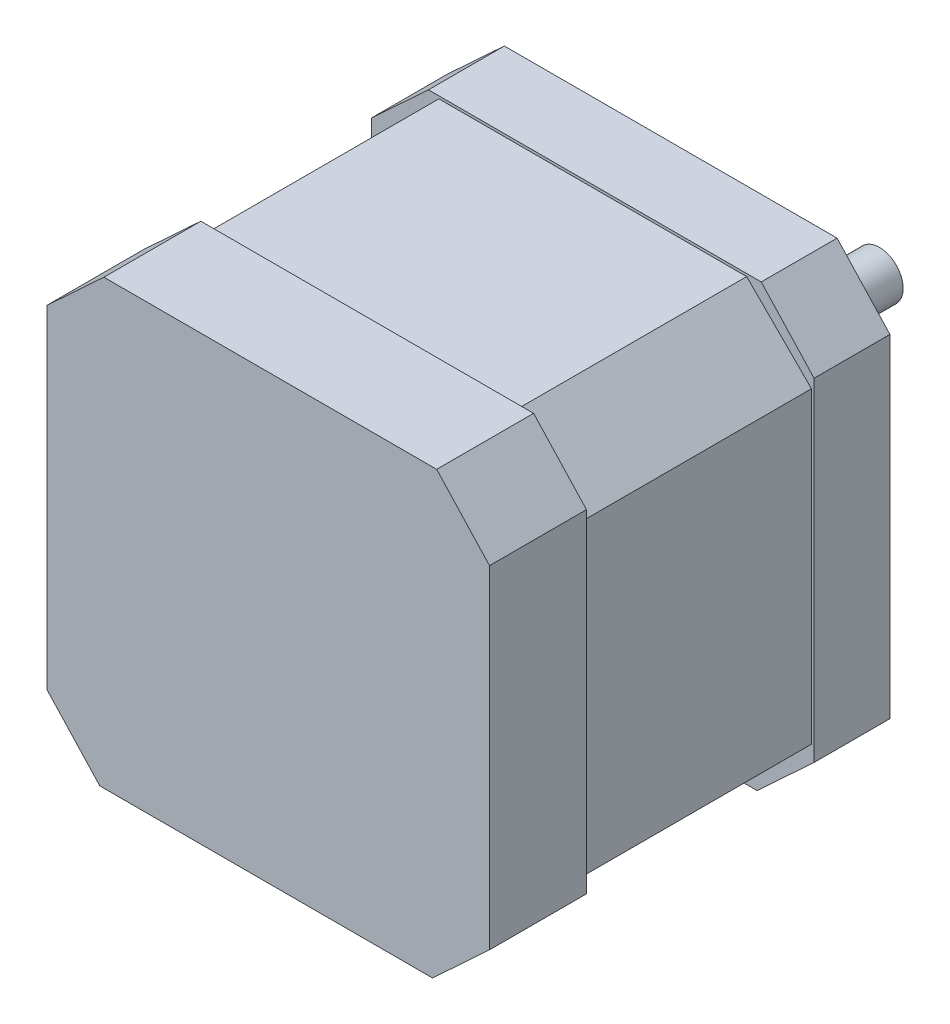
ISO-10303-21;
HEADER;
FILE_DESCRIPTION(('STEP AP214'),'2;1');
FILE_NAME('part.step','',(''),(''),'','','');
FILE_SCHEMA(('AUTOMOTIVE_DESIGN { 1 0 10303 214 1 1 1 1 }'));
ENDSEC;
DATA;
#1=APPLICATION_CONTEXT('core data for automotive mechanical design processes');
#2=APPLICATION_PROTOCOL_DEFINITION('international standard','automotive_design',2000,#1);
#3=PRODUCT_CONTEXT('',#1,'mechanical');
#4=PRODUCT('Part','Part','',(#3));
#5=PRODUCT_RELATED_PRODUCT_CATEGORY('part','',(#4));
#6=PRODUCT_DEFINITION_FORMATION('','',#4);
#7=PRODUCT_DEFINITION_CONTEXT('part definition',#1,'design');
#8=PRODUCT_DEFINITION('design','',#6,#7);
#9=PRODUCT_DEFINITION_SHAPE('','',#8);
#10=(LENGTH_UNIT() NAMED_UNIT(*) SI_UNIT(.MILLI.,.METRE.));
#11=(NAMED_UNIT(*) PLANE_ANGLE_UNIT() SI_UNIT($,.RADIAN.));
#12=(NAMED_UNIT(*) SI_UNIT($,.STERADIAN.) SOLID_ANGLE_UNIT());
#13=UNCERTAINTY_MEASURE_WITH_UNIT(LENGTH_MEASURE(1.E-05),#10,'distance_accuracy_value','');
#14=(GEOMETRIC_REPRESENTATION_CONTEXT(3) GLOBAL_UNCERTAINTY_ASSIGNED_CONTEXT((#13)) GLOBAL_UNIT_ASSIGNED_CONTEXT((#10,
#11,#12)) REPRESENTATION_CONTEXT('',''));
#15=CARTESIAN_POINT('',(0.,0.,0.));
#16=DIRECTION('',(0.,0.,1.));
#17=DIRECTION('',(1.,0.,0.));
#18=AXIS2_PLACEMENT_3D('',#15,#16,#17);
#19=CARTESIAN_POINT('',(21.,0.,38.));
#20=DIRECTION('',(1.,0.,0.));
#21=DIRECTION('',(0.,1.,0.));
#22=AXIS2_PLACEMENT_3D('',#19,#20,#21);
#23=PLANE('',#22);
#24=DIRECTION('',(0.,0.,-1.));
#25=VECTOR('',#24,1.);
#26=CARTESIAN_POINT('',(21.,-15.9841759962391,38.));
#27=LINE('',#26,#25);
#28=CARTESIAN_POINT('',(21.,-15.9841759962391,38.));
#29=VERTEX_POINT('',#28);
#30=CARTESIAN_POINT('',(21.,-15.9841759962391,28.8));
#31=VERTEX_POINT('',#30);
#32=EDGE_CURVE('E380',#29,#31,#27,.T.);
#33=ORIENTED_EDGE('',*,*,#32,.T.);
#34=DIRECTION('',(0.,1.,0.));
#35=VECTOR('',#34,1.);
#36=CARTESIAN_POINT('',(21.,0.,28.8));
#37=LINE('',#36,#35);
#38=CARTESIAN_POINT('',(21.,15.5921718725903,28.8));
#39=VERTEX_POINT('',#38);
#40=EDGE_CURVE('E107',#31,#39,#37,.T.);
#41=ORIENTED_EDGE('',*,*,#40,.T.);
#42=DIRECTION('',(0.,0.,-1.));
#43=VECTOR('',#42,1.);
#44=CARTESIAN_POINT('',(21.,15.5921718725903,38.));
#45=LINE('',#44,#43);
#46=CARTESIAN_POINT('',(21.,15.5921718725903,38.));
#47=VERTEX_POINT('',#46);
#48=EDGE_CURVE('E408',#47,#39,#45,.T.);
#49=ORIENTED_EDGE('',*,*,#48,.F.);
#50=DIRECTION('',(0.,-1.,0.));
#51=VECTOR('',#50,1.);
#52=CARTESIAN_POINT('',(21.,0.,38.));
#53=LINE('',#52,#51);
#54=EDGE_CURVE('E336',#47,#29,#53,.T.);
#55=ORIENTED_EDGE('',*,*,#54,.T.);
#56=EDGE_LOOP('',(#33,#41,#49,#55));
#57=FACE_BOUND('',#56,.T.);
#58=ADVANCED_FACE('F85',(#57),#23,.T.);
#59=CARTESIAN_POINT('',(19.0627004123154,17.6808781736177,38.));
#60=DIRECTION('',(-0.733180785089054,-0.680033775908373,0.));
#61=DIRECTION('',(0.680033775908373,-0.733180785089054,0.));
#62=AXIS2_PLACEMENT_3D('',#59,#60,#61);
#63=PLANE('',#62);
#64=DIRECTION('',(0.680033775908373,-0.733180785089054,0.));
#65=VECTOR('',#64,1.);
#66=CARTESIAN_POINT('',(19.0627004123154,17.6808781736177,28.8));
#67=LINE('',#66,#65);
#68=CARTESIAN_POINT('',(15.9841759962391,21.,28.8));
#69=VERTEX_POINT('',#68);
#70=EDGE_CURVE('E332',#69,#39,#67,.T.);
#71=ORIENTED_EDGE('',*,*,#70,.F.);
#72=DIRECTION('',(0.,0.,-1.));
#73=VECTOR('',#72,1.);
#74=CARTESIAN_POINT('',(15.9841759962391,21.,38.));
#75=LINE('',#74,#73);
#76=CARTESIAN_POINT('',(15.9841759962391,21.,38.));
#77=VERTEX_POINT('',#76);
#78=EDGE_CURVE('E404',#77,#69,#75,.T.);
#79=ORIENTED_EDGE('',*,*,#78,.F.);
#80=DIRECTION('',(-0.680033775908373,0.733180785089054,0.));
#81=VECTOR('',#80,1.);
#82=CARTESIAN_POINT('',(19.0627004123154,17.6808781736177,38.));
#83=LINE('',#82,#81);
#84=EDGE_CURVE('E339',#47,#77,#83,.T.);
#85=ORIENTED_EDGE('',*,*,#84,.F.);
#86=ORIENTED_EDGE('',*,*,#48,.T.);
#87=EDGE_LOOP('',(#71,#79,#85,#86));
#88=FACE_BOUND('',#87,.T.);
#89=ADVANCED_FACE('F480',(#88),#63,.F.);
#90=CARTESIAN_POINT('',(0.,21.,38.));
#91=DIRECTION('',(0.,1.,0.));
#92=DIRECTION('',(0.,0.,1.));
#93=AXIS2_PLACEMENT_3D('',#90,#91,#92);
#94=PLANE('',#93);
#95=ORIENTED_EDGE('',*,*,#78,.T.);
#96=DIRECTION('',(-1.,0.,0.));
#97=VECTOR('',#96,1.);
#98=CARTESIAN_POINT('',(0.,21.,28.8));
#99=LINE('',#98,#97);
#100=CARTESIAN_POINT('',(-15.5921718725903,21.,28.8));
#101=VERTEX_POINT('',#100);
#102=EDGE_CURVE('E329',#69,#101,#99,.T.);
#103=ORIENTED_EDGE('',*,*,#102,.T.);
#104=DIRECTION('',(0.,0.,-1.));
#105=VECTOR('',#104,1.);
#106=CARTESIAN_POINT('',(-15.5921718725903,21.,38.));
#107=LINE('',#106,#105);
#108=CARTESIAN_POINT('',(-15.5921718725903,21.,38.));
#109=VERTEX_POINT('',#108);
#110=EDGE_CURVE('E400',#109,#101,#107,.T.);
#111=ORIENTED_EDGE('',*,*,#110,.F.);
#112=DIRECTION('',(1.,0.,0.));
#113=VECTOR('',#112,1.);
#114=CARTESIAN_POINT('',(0.,21.,38.));
#115=LINE('',#114,#113);
#116=EDGE_CURVE('E342',#109,#77,#115,.T.);
#117=ORIENTED_EDGE('',*,*,#116,.T.);
#118=EDGE_LOOP('',(#95,#103,#111,#117));
#119=FACE_BOUND('',#118,.T.);
#120=ADVANCED_FACE('F486',(#119),#94,.T.);
#121=CARTESIAN_POINT('',(-17.6808781736177,19.0627004123154,38.));
#122=DIRECTION('',(-0.680033775908373,0.733180785089054,0.));
#123=DIRECTION('',(-0.733180785089054,-0.680033775908373,0.));
#124=AXIS2_PLACEMENT_3D('',#121,#122,#123);
#125=PLANE('',#124);
#126=ORIENTED_EDGE('',*,*,#110,.T.);
#127=DIRECTION('',(-0.733180785089054,-0.680033775908373,0.));
#128=VECTOR('',#127,1.);
#129=CARTESIAN_POINT('',(-17.6808781736177,19.0627004123154,28.8));
#130=LINE('',#129,#128);
#131=CARTESIAN_POINT('',(-21.,15.9841759962391,28.8));
#132=VERTEX_POINT('',#131);
#133=EDGE_CURVE('E326',#101,#132,#130,.T.);
#134=ORIENTED_EDGE('',*,*,#133,.T.);
#135=DIRECTION('',(0.,0.,-1.));
#136=VECTOR('',#135,1.);
#137=CARTESIAN_POINT('',(-21.,15.9841759962391,38.));
#138=LINE('',#137,#136);
#139=CARTESIAN_POINT('',(-21.,15.9841759962391,38.));
#140=VERTEX_POINT('',#139);
#141=EDGE_CURVE('E396',#140,#132,#138,.T.);
#142=ORIENTED_EDGE('',*,*,#141,.F.);
#143=DIRECTION('',(0.733180785089054,0.680033775908373,0.));
#144=VECTOR('',#143,1.);
#145=CARTESIAN_POINT('',(-17.6808781736177,19.0627004123154,38.));
#146=LINE('',#145,#144);
#147=EDGE_CURVE('E345',#140,#109,#146,.T.);
#148=ORIENTED_EDGE('',*,*,#147,.T.);
#149=EDGE_LOOP('',(#126,#134,#142,#148));
#150=FACE_BOUND('',#149,.T.);
#151=ADVANCED_FACE('F572',(#150),#125,.T.);
#152=CARTESIAN_POINT('',(-21.,0.,38.));
#153=DIRECTION('',(1.,0.,0.));
#154=DIRECTION('',(0.,1.,0.));
#155=AXIS2_PLACEMENT_3D('',#152,#153,#154);
#156=PLANE('',#155);
#157=DIRECTION('',(0.,1.,0.));
#158=VECTOR('',#157,1.);
#159=CARTESIAN_POINT('',(-21.,0.,28.8));
#160=LINE('',#159,#158);
#161=CARTESIAN_POINT('',(-21.,-15.5921718725903,28.8));
#162=VERTEX_POINT('',#161);
#163=EDGE_CURVE('E324',#162,#132,#160,.T.);
#164=ORIENTED_EDGE('',*,*,#163,.F.);
#165=DIRECTION('',(0.,0.,-1.));
#166=VECTOR('',#165,1.);
#167=CARTESIAN_POINT('',(-21.,-15.5921718725903,38.));
#168=LINE('',#167,#166);
#169=CARTESIAN_POINT('',(-21.,-15.5921718725903,38.));
#170=VERTEX_POINT('',#169);
#171=EDGE_CURVE('E392',#170,#162,#168,.T.);
#172=ORIENTED_EDGE('',*,*,#171,.F.);
#173=DIRECTION('',(0.,-1.,0.));
#174=VECTOR('',#173,1.);
#175=CARTESIAN_POINT('',(-21.,0.,38.));
#176=LINE('',#175,#174);
#177=EDGE_CURVE('E348',#140,#170,#176,.T.);
#178=ORIENTED_EDGE('',*,*,#177,.F.);
#179=ORIENTED_EDGE('',*,*,#141,.T.);
#180=EDGE_LOOP('',(#164,#172,#178,#179));
#181=FACE_BOUND('',#180,.T.);
#182=ADVANCED_FACE('F569',(#181),#156,.F.);
#183=CARTESIAN_POINT('',(-19.0627004123154,-17.6808781736177,38.));
#184=DIRECTION('',(-0.733180785089054,-0.680033775908373,0.));
#185=DIRECTION('',(0.680033775908373,-0.733180785089054,0.));
#186=AXIS2_PLACEMENT_3D('',#183,#184,#185);
#187=PLANE('',#186);
#188=ORIENTED_EDGE('',*,*,#171,.T.);
#189=DIRECTION('',(0.680033775908373,-0.733180785089054,0.));
#190=VECTOR('',#189,1.);
#191=CARTESIAN_POINT('',(-19.0627004123154,-17.6808781736177,28.8));
#192=LINE('',#191,#190);
#193=CARTESIAN_POINT('',(-15.9841759962391,-21.,28.8));
#194=VERTEX_POINT('',#193);
#195=EDGE_CURVE('E321',#162,#194,#192,.T.);
#196=ORIENTED_EDGE('',*,*,#195,.T.);
#197=DIRECTION('',(0.,0.,-1.));
#198=VECTOR('',#197,1.);
#199=CARTESIAN_POINT('',(-15.9841759962391,-21.,38.));
#200=LINE('',#199,#198);
#201=CARTESIAN_POINT('',(-15.9841759962391,-21.,38.));
#202=VERTEX_POINT('',#201);
#203=EDGE_CURVE('E388',#202,#194,#200,.T.);
#204=ORIENTED_EDGE('',*,*,#203,.F.);
#205=DIRECTION('',(-0.680033775908373,0.733180785089054,0.));
#206=VECTOR('',#205,1.);
#207=CARTESIAN_POINT('',(-19.0627004123154,-17.6808781736177,38.));
#208=LINE('',#207,#206);
#209=EDGE_CURVE('E350',#202,#170,#208,.T.);
#210=ORIENTED_EDGE('',*,*,#209,.T.);
#211=EDGE_LOOP('',(#188,#196,#204,#210));
#212=FACE_BOUND('',#211,.T.);
#213=ADVANCED_FACE('F552',(#212),#187,.T.);
#214=CARTESIAN_POINT('',(0.,-21.,38.));
#215=DIRECTION('',(0.,1.,0.));
#216=DIRECTION('',(0.,0.,1.));
#217=AXIS2_PLACEMENT_3D('',#214,#215,#216);
#218=PLANE('',#217);
#219=DIRECTION('',(-1.,0.,0.));
#220=VECTOR('',#219,1.);
#221=CARTESIAN_POINT('',(0.,-21.,28.8));
#222=LINE('',#221,#220);
#223=CARTESIAN_POINT('',(15.5921718725902,-21.,28.8));
#224=VERTEX_POINT('',#223);
#225=EDGE_CURVE('E319',#224,#194,#222,.T.);
#226=ORIENTED_EDGE('',*,*,#225,.F.);
#227=DIRECTION('',(0.,0.,-1.));
#228=VECTOR('',#227,1.);
#229=CARTESIAN_POINT('',(15.5921718725902,-21.,38.));
#230=LINE('',#229,#228);
#231=CARTESIAN_POINT('',(15.5921718725902,-21.,38.));
#232=VERTEX_POINT('',#231);
#233=EDGE_CURVE('E384',#232,#224,#230,.T.);
#234=ORIENTED_EDGE('',*,*,#233,.F.);
#235=DIRECTION('',(1.,0.,0.));
#236=VECTOR('',#235,1.);
#237=CARTESIAN_POINT('',(0.,-21.,38.));
#238=LINE('',#237,#236);
#239=EDGE_CURVE('E353',#202,#232,#238,.T.);
#240=ORIENTED_EDGE('',*,*,#239,.F.);
#241=ORIENTED_EDGE('',*,*,#203,.T.);
#242=EDGE_LOOP('',(#226,#234,#240,#241));
#243=FACE_BOUND('',#242,.T.);
#244=ADVANCED_FACE('F540',(#243),#218,.F.);
#245=CARTESIAN_POINT('',(17.6808781736177,-19.0627004123154,38.));
#246=DIRECTION('',(-0.680033775908373,0.733180785089054,0.));
#247=DIRECTION('',(-0.733180785089054,-0.680033775908373,0.));
#248=AXIS2_PLACEMENT_3D('',#245,#246,#247);
#249=PLANE('',#248);
#250=DIRECTION('',(-0.733180785089054,-0.680033775908373,0.));
#251=VECTOR('',#250,1.);
#252=CARTESIAN_POINT('',(17.6808781736177,-19.0627004123154,28.8));
#253=LINE('',#252,#251);
#254=EDGE_CURVE('E92',#31,#224,#253,.T.);
#255=ORIENTED_EDGE('',*,*,#254,.F.);
#256=ORIENTED_EDGE('',*,*,#32,.F.);
#257=DIRECTION('',(0.733180785089054,0.680033775908373,0.));
#258=VECTOR('',#257,1.);
#259=CARTESIAN_POINT('',(17.6808781736177,-19.0627004123154,38.));
#260=LINE('',#259,#258);
#261=EDGE_CURVE('E355',#232,#29,#260,.T.);
#262=ORIENTED_EDGE('',*,*,#261,.F.);
#263=ORIENTED_EDGE('',*,*,#233,.T.);
#264=EDGE_LOOP('',(#255,#256,#262,#263));
#265=FACE_BOUND('',#264,.T.);
#266=ADVANCED_FACE('F534',(#265),#249,.F.);
#267=CARTESIAN_POINT('',(0.,0.,38.));
#268=DIRECTION('',(0.,0.,1.));
#269=DIRECTION('',(1.,0.,0.));
#270=AXIS2_PLACEMENT_3D('',#267,#268,#269);
#271=PLANE('',#270);
#272=ORIENTED_EDGE('',*,*,#54,.F.);
#273=ORIENTED_EDGE('',*,*,#84,.T.);
#274=ORIENTED_EDGE('',*,*,#116,.F.);
#275=ORIENTED_EDGE('',*,*,#147,.F.);
#276=ORIENTED_EDGE('',*,*,#177,.T.);
#277=ORIENTED_EDGE('',*,*,#209,.F.);
#278=ORIENTED_EDGE('',*,*,#239,.T.);
#279=ORIENTED_EDGE('',*,*,#261,.T.);
#280=EDGE_LOOP('',(#272,#273,#274,#275,#276,#277,#278,#279));
#281=FACE_BOUND('',#280,.T.);
#282=ADVANCED_FACE('F544',(#281),#271,.T.);
#283=CARTESIAN_POINT('',(0.,0.,28.8));
#284=DIRECTION('',(0.,0.,-1.));
#285=DIRECTION('',(-1.,0.,0.));
#286=AXIS2_PLACEMENT_3D('',#283,#284,#285);
#287=PLANE('',#286);
#288=ORIENTED_EDGE('',*,*,#254,.T.);
#289=ORIENTED_EDGE('',*,*,#225,.T.);
#290=ORIENTED_EDGE('',*,*,#195,.F.);
#291=ORIENTED_EDGE('',*,*,#163,.T.);
#292=ORIENTED_EDGE('',*,*,#133,.F.);
#293=ORIENTED_EDGE('',*,*,#102,.F.);
#294=ORIENTED_EDGE('',*,*,#70,.T.);
#295=ORIENTED_EDGE('',*,*,#40,.F.);
#296=EDGE_LOOP('',(#288,#289,#290,#291,#292,#293,#294,#295));
#297=FACE_BOUND('',#296,.T.);
#298=DIRECTION('',(-0.707106781186548,0.707106781186547,0.));
#299=VECTOR('',#298,1.);
#300=CARTESIAN_POINT('',(17.6776695296637,17.6776695296637,28.8));
#301=LINE('',#300,#299);
#302=CARTESIAN_POINT('',(20.75,14.6053390593274,28.8));
#303=VERTEX_POINT('',#302);
#304=CARTESIAN_POINT('',(14.6053390593274,20.75,28.8));
#305=VERTEX_POINT('',#304);
#306=EDGE_CURVE('E249',#303,#305,#301,.T.);
#307=ORIENTED_EDGE('',*,*,#306,.T.);
#308=DIRECTION('',(1.,0.,0.));
#309=VECTOR('',#308,1.);
#310=CARTESIAN_POINT('',(0.,20.75,28.8));
#311=LINE('',#310,#309);
#312=CARTESIAN_POINT('',(-14.6053390593274,20.75,28.8));
#313=VERTEX_POINT('',#312);
#314=EDGE_CURVE('E263',#313,#305,#311,.T.);
#315=ORIENTED_EDGE('',*,*,#314,.F.);
#316=DIRECTION('',(0.707106781186547,0.707106781186548,0.));
#317=VECTOR('',#316,1.);
#318=CARTESIAN_POINT('',(-17.6776695296637,17.6776695296637,28.8));
#319=LINE('',#318,#317);
#320=CARTESIAN_POINT('',(-20.75,14.6053390593274,28.8));
#321=VERTEX_POINT('',#320);
#322=EDGE_CURVE('E271',#321,#313,#319,.T.);
#323=ORIENTED_EDGE('',*,*,#322,.F.);
#324=DIRECTION('',(0.,1.,0.));
#325=VECTOR('',#324,1.);
#326=CARTESIAN_POINT('',(-20.75,0.,28.8));
#327=LINE('',#326,#325);
#328=CARTESIAN_POINT('',(-20.75,-14.6053390593274,28.8));
#329=VERTEX_POINT('',#328);
#330=EDGE_CURVE('E273',#329,#321,#327,.T.);
#331=ORIENTED_EDGE('',*,*,#330,.F.);
#332=DIRECTION('',(-0.707106781186547,0.707106781186548,0.));
#333=VECTOR('',#332,1.);
#334=CARTESIAN_POINT('',(-17.6776695296637,-17.6776695296637,28.8));
#335=LINE('',#334,#333);
#336=CARTESIAN_POINT('',(-14.6053390593274,-20.75,28.8));
#337=VERTEX_POINT('',#336);
#338=EDGE_CURVE('E279',#337,#329,#335,.T.);
#339=ORIENTED_EDGE('',*,*,#338,.F.);
#340=DIRECTION('',(1.,0.,0.));
#341=VECTOR('',#340,1.);
#342=CARTESIAN_POINT('',(0.,-20.75,28.8));
#343=LINE('',#342,#341);
#344=CARTESIAN_POINT('',(14.6053390593274,-20.75,28.8));
#345=VERTEX_POINT('',#344);
#346=EDGE_CURVE('E282',#337,#345,#343,.T.);
#347=ORIENTED_EDGE('',*,*,#346,.T.);
#348=DIRECTION('',(0.707106781186547,0.707106781186548,0.));
#349=VECTOR('',#348,1.);
#350=CARTESIAN_POINT('',(17.6776695296637,-17.6776695296637,28.8));
#351=LINE('',#350,#349);
#352=CARTESIAN_POINT('',(20.75,-14.6053390593274,28.8));
#353=VERTEX_POINT('',#352);
#354=EDGE_CURVE('E285',#345,#353,#351,.T.);
#355=ORIENTED_EDGE('',*,*,#354,.T.);
#356=DIRECTION('',(0.,1.,0.));
#357=VECTOR('',#356,1.);
#358=CARTESIAN_POINT('',(20.75,0.,28.8));
#359=LINE('',#358,#357);
#360=EDGE_CURVE('E267',#353,#303,#359,.T.);
#361=ORIENTED_EDGE('',*,*,#360,.T.);
#362=EDGE_LOOP('',(#307,#315,#323,#331,#339,#347,#355,#361));
#363=FACE_BOUND('',#362,.T.);
#364=ADVANCED_FACE('F261',(#297,#363),#287,.T.);
#365=CARTESIAN_POINT('',(17.6776695296637,17.6776695296637,-86.9741340859453));
#366=DIRECTION('',(0.707106781186547,0.707106781186548,0.));
#367=DIRECTION('',(-0.707106781186548,0.707106781186547,0.));
#368=AXIS2_PLACEMENT_3D('',#365,#366,#367);
#369=PLANE('',#368);
#370=DIRECTION('',(0.,0.,1.));
#371=VECTOR('',#370,1.);
#372=CARTESIAN_POINT('',(14.6053390593274,20.75,-86.9741340859453));
#373=LINE('',#372,#371);
#374=CARTESIAN_POINT('',(14.6053390593274,20.75,7.2));
#375=VERTEX_POINT('',#374);
#376=EDGE_CURVE('E245',#375,#305,#373,.T.);
#377=ORIENTED_EDGE('',*,*,#376,.T.);
#378=ORIENTED_EDGE('',*,*,#306,.F.);
#379=DIRECTION('',(0.,0.,1.));
#380=VECTOR('',#379,1.);
#381=CARTESIAN_POINT('',(20.75,14.6053390593274,-86.9741340859453));
#382=LINE('',#381,#380);
#383=CARTESIAN_POINT('',(20.75,14.6053390593274,7.2));
#384=VERTEX_POINT('',#383);
#385=EDGE_CURVE('E256',#384,#303,#382,.T.);
#386=ORIENTED_EDGE('',*,*,#385,.F.);
#387=DIRECTION('',(0.707106781186548,-0.707106781186547,0.));
#388=VECTOR('',#387,1.);
#389=CARTESIAN_POINT('',(17.6776695296637,17.6776695296637,7.2));
#390=LINE('',#389,#388);
#391=EDGE_CURVE('E251',#375,#384,#390,.T.);
#392=ORIENTED_EDGE('',*,*,#391,.F.);
#393=EDGE_LOOP('',(#377,#378,#386,#392));
#394=FACE_BOUND('',#393,.T.);
#395=ADVANCED_FACE('F247',(#394),#369,.T.);
#396=CARTESIAN_POINT('',(0.,20.75,-86.9741340859453));
#397=DIRECTION('',(0.,-1.,0.));
#398=DIRECTION('',(0.,0.,-1.));
#399=AXIS2_PLACEMENT_3D('',#396,#397,#398);
#400=PLANE('',#399);
#401=DIRECTION('',(-1.,0.,0.));
#402=VECTOR('',#401,1.);
#403=CARTESIAN_POINT('',(0.,20.75,7.2));
#404=LINE('',#403,#402);
#405=CARTESIAN_POINT('',(-14.6053390593274,20.75,7.2));
#406=VERTEX_POINT('',#405);
#407=EDGE_CURVE('E303',#375,#406,#404,.T.);
#408=ORIENTED_EDGE('',*,*,#407,.T.);
#409=DIRECTION('',(0.,0.,1.));
#410=VECTOR('',#409,1.);
#411=CARTESIAN_POINT('',(-14.6053390593274,20.75,-86.9741340859453));
#412=LINE('',#411,#410);
#413=EDGE_CURVE('E255',#406,#313,#412,.T.);
#414=ORIENTED_EDGE('',*,*,#413,.T.);
#415=ORIENTED_EDGE('',*,*,#314,.T.);
#416=ORIENTED_EDGE('',*,*,#376,.F.);
#417=EDGE_LOOP('',(#408,#414,#415,#416));
#418=FACE_BOUND('',#417,.T.);
#419=ADVANCED_FACE('F269',(#418),#400,.F.);
#420=CARTESIAN_POINT('',(-17.6776695296637,17.6776695296637,-86.9741340859453));
#421=DIRECTION('',(0.707106781186548,-0.707106781186547,0.));
#422=DIRECTION('',(0.707106781186547,0.707106781186548,0.));
#423=AXIS2_PLACEMENT_3D('',#420,#421,#422);
#424=PLANE('',#423);
#425=DIRECTION('',(-0.707106781186547,-0.707106781186548,0.));
#426=VECTOR('',#425,1.);
#427=CARTESIAN_POINT('',(-17.6776695296637,17.6776695296637,7.2));
#428=LINE('',#427,#426);
#429=CARTESIAN_POINT('',(-20.75,14.6053390593274,7.2));
#430=VERTEX_POINT('',#429);
#431=EDGE_CURVE('E432',#406,#430,#428,.T.);
#432=ORIENTED_EDGE('',*,*,#431,.T.);
#433=DIRECTION('',(0.,0.,1.));
#434=VECTOR('',#433,1.);
#435=CARTESIAN_POINT('',(-20.75,14.6053390593274,-86.9741340859453));
#436=LINE('',#435,#434);
#437=EDGE_CURVE('E295',#430,#321,#436,.T.);
#438=ORIENTED_EDGE('',*,*,#437,.T.);
#439=ORIENTED_EDGE('',*,*,#322,.T.);
#440=ORIENTED_EDGE('',*,*,#413,.F.);
#441=EDGE_LOOP('',(#432,#438,#439,#440));
#442=FACE_BOUND('',#441,.T.);
#443=ADVANCED_FACE('F470',(#442),#424,.F.);
#444=CARTESIAN_POINT('',(-20.75,0.,-86.9741340859453));
#445=DIRECTION('',(1.,0.,0.));
#446=DIRECTION('',(0.,0.,-1.));
#447=AXIS2_PLACEMENT_3D('',#444,#445,#446);
#448=PLANE('',#447);
#449=DIRECTION('',(0.,-1.,0.));
#450=VECTOR('',#449,1.);
#451=CARTESIAN_POINT('',(-20.75,0.,7.2));
#452=LINE('',#451,#450);
#453=CARTESIAN_POINT('',(-20.75,-14.6053390593274,7.2));
#454=VERTEX_POINT('',#453);
#455=EDGE_CURVE('E434',#430,#454,#452,.T.);
#456=ORIENTED_EDGE('',*,*,#455,.T.);
#457=DIRECTION('',(0.,0.,1.));
#458=VECTOR('',#457,1.);
#459=CARTESIAN_POINT('',(-20.75,-14.6053390593274,-86.9741340859453));
#460=LINE('',#459,#458);
#461=EDGE_CURVE('E293',#454,#329,#460,.T.);
#462=ORIENTED_EDGE('',*,*,#461,.T.);
#463=ORIENTED_EDGE('',*,*,#330,.T.);
#464=ORIENTED_EDGE('',*,*,#437,.F.);
#465=EDGE_LOOP('',(#456,#462,#463,#464));
#466=FACE_BOUND('',#465,.T.);
#467=ADVANCED_FACE('F467',(#466),#448,.F.);
#468=CARTESIAN_POINT('',(-17.6776695296637,-17.6776695296637,-86.9741340859453));
#469=DIRECTION('',(0.707106781186548,0.707106781186547,0.));
#470=DIRECTION('',(-0.707106781186547,0.707106781186548,0.));
#471=AXIS2_PLACEMENT_3D('',#468,#469,#470);
#472=PLANE('',#471);
#473=DIRECTION('',(0.707106781186547,-0.707106781186548,0.));
#474=VECTOR('',#473,1.);
#475=CARTESIAN_POINT('',(-17.6776695296637,-17.6776695296637,7.2));
#476=LINE('',#475,#474);
#477=CARTESIAN_POINT('',(-14.6053390593274,-20.75,7.2));
#478=VERTEX_POINT('',#477);
#479=EDGE_CURVE('E436',#454,#478,#476,.T.);
#480=ORIENTED_EDGE('',*,*,#479,.T.);
#481=DIRECTION('',(0.,0.,1.));
#482=VECTOR('',#481,1.);
#483=CARTESIAN_POINT('',(-14.6053390593274,-20.75,-86.9741340859453));
#484=LINE('',#483,#482);
#485=EDGE_CURVE('E291',#478,#337,#484,.T.);
#486=ORIENTED_EDGE('',*,*,#485,.T.);
#487=ORIENTED_EDGE('',*,*,#338,.T.);
#488=ORIENTED_EDGE('',*,*,#461,.F.);
#489=EDGE_LOOP('',(#480,#486,#487,#488));
#490=FACE_BOUND('',#489,.T.);
#491=ADVANCED_FACE('F465',(#490),#472,.F.);
#492=CARTESIAN_POINT('',(0.,-20.75,-86.9741340859453));
#493=DIRECTION('',(0.,-1.,0.));
#494=DIRECTION('',(0.,0.,-1.));
#495=AXIS2_PLACEMENT_3D('',#492,#493,#494);
#496=PLANE('',#495);
#497=DIRECTION('',(0.,0.,1.));
#498=VECTOR('',#497,1.);
#499=CARTESIAN_POINT('',(14.6053390593274,-20.75,-86.9741340859453));
#500=LINE('',#499,#498);
#501=CARTESIAN_POINT('',(14.6053390593274,-20.75,7.2));
#502=VERTEX_POINT('',#501);
#503=EDGE_CURVE('E289',#502,#345,#500,.T.);
#504=ORIENTED_EDGE('',*,*,#503,.T.);
#505=ORIENTED_EDGE('',*,*,#346,.F.);
#506=ORIENTED_EDGE('',*,*,#485,.F.);
#507=DIRECTION('',(-1.,0.,0.));
#508=VECTOR('',#507,1.);
#509=CARTESIAN_POINT('',(0.,-20.75,7.2));
#510=LINE('',#509,#508);
#511=EDGE_CURVE('E438',#502,#478,#510,.T.);
#512=ORIENTED_EDGE('',*,*,#511,.F.);
#513=EDGE_LOOP('',(#504,#505,#506,#512));
#514=FACE_BOUND('',#513,.T.);
#515=ADVANCED_FACE('F459',(#514),#496,.T.);
#516=CARTESIAN_POINT('',(17.6776695296637,-17.6776695296637,-86.9741340859453));
#517=DIRECTION('',(0.707106781186548,-0.707106781186547,0.));
#518=DIRECTION('',(0.707106781186547,0.707106781186548,0.));
#519=AXIS2_PLACEMENT_3D('',#516,#517,#518);
#520=PLANE('',#519);
#521=DIRECTION('',(0.,0.,1.));
#522=VECTOR('',#521,1.);
#523=CARTESIAN_POINT('',(20.75,-14.6053390593274,-86.9741340859453));
#524=LINE('',#523,#522);
#525=CARTESIAN_POINT('',(20.75,-14.6053390593274,7.2));
#526=VERTEX_POINT('',#525);
#527=EDGE_CURVE('E287',#526,#353,#524,.T.);
#528=ORIENTED_EDGE('',*,*,#527,.T.);
#529=ORIENTED_EDGE('',*,*,#354,.F.);
#530=ORIENTED_EDGE('',*,*,#503,.F.);
#531=DIRECTION('',(-0.707106781186547,-0.707106781186548,0.));
#532=VECTOR('',#531,1.);
#533=CARTESIAN_POINT('',(17.6776695296637,-17.6776695296637,7.2));
#534=LINE('',#533,#532);
#535=EDGE_CURVE('E441',#526,#502,#534,.T.);
#536=ORIENTED_EDGE('',*,*,#535,.F.);
#537=EDGE_LOOP('',(#528,#529,#530,#536));
#538=FACE_BOUND('',#537,.T.);
#539=ADVANCED_FACE('F452',(#538),#520,.T.);
#540=CARTESIAN_POINT('',(20.75,0.,-86.9741340859453));
#541=DIRECTION('',(1.,0.,0.));
#542=DIRECTION('',(0.,0.,-1.));
#543=AXIS2_PLACEMENT_3D('',#540,#541,#542);
#544=PLANE('',#543);
#545=ORIENTED_EDGE('',*,*,#385,.T.);
#546=ORIENTED_EDGE('',*,*,#360,.F.);
#547=ORIENTED_EDGE('',*,*,#527,.F.);
#548=DIRECTION('',(0.,-1.,0.));
#549=VECTOR('',#548,1.);
#550=CARTESIAN_POINT('',(20.75,0.,7.2));
#551=LINE('',#550,#549);
#552=EDGE_CURVE('E300',#384,#526,#551,.T.);
#553=ORIENTED_EDGE('',*,*,#552,.F.);
#554=EDGE_LOOP('',(#545,#546,#547,#553));
#555=FACE_BOUND('',#554,.T.);
#556=ADVANCED_FACE('F449',(#555),#544,.T.);
#557=CARTESIAN_POINT('',(0.,0.,7.2));
#558=DIRECTION('',(0.,0.,1.));
#559=DIRECTION('',(1.,0.,0.));
#560=AXIS2_PLACEMENT_3D('',#557,#558,#559);
#561=PLANE('',#560);
#562=DIRECTION('',(-0.680033775908373,0.733180785089054,0.));
#563=VECTOR('',#562,1.);
#564=CARTESIAN_POINT('',(19.0627004123154,17.6808781736177,7.2));
#565=LINE('',#564,#563);
#566=CARTESIAN_POINT('',(21.,15.5921718725903,7.2));
#567=VERTEX_POINT('',#566);
#568=CARTESIAN_POINT('',(15.9841759962391,21.,7.2));
#569=VERTEX_POINT('',#568);
#570=EDGE_CURVE('E314',#567,#569,#565,.T.);
#571=ORIENTED_EDGE('',*,*,#570,.T.);
#572=DIRECTION('',(1.,0.,0.));
#573=VECTOR('',#572,1.);
#574=CARTESIAN_POINT('',(0.,21.,7.2));
#575=LINE('',#574,#573);
#576=CARTESIAN_POINT('',(-15.5921718725903,21.,7.2));
#577=VERTEX_POINT('',#576);
#578=EDGE_CURVE('E311',#577,#569,#575,.T.);
#579=ORIENTED_EDGE('',*,*,#578,.F.);
#580=DIRECTION('',(0.733180785089054,0.680033775908373,0.));
#581=VECTOR('',#580,1.);
#582=CARTESIAN_POINT('',(-17.6808781736177,19.0627004123154,7.2));
#583=LINE('',#582,#581);
#584=CARTESIAN_POINT('',(-21.,15.9841759962391,7.2));
#585=VERTEX_POINT('',#584);
#586=EDGE_CURVE('E308',#585,#577,#583,.T.);
#587=ORIENTED_EDGE('',*,*,#586,.F.);
#588=DIRECTION('',(0.,-1.,0.));
#589=VECTOR('',#588,1.);
#590=CARTESIAN_POINT('',(-21.,0.,7.2));
#591=LINE('',#590,#589);
#592=CARTESIAN_POINT('',(-21.,-15.5921718725903,7.2));
#593=VERTEX_POINT('',#592);
#594=EDGE_CURVE('E306',#585,#593,#591,.T.);
#595=ORIENTED_EDGE('',*,*,#594,.T.);
#596=DIRECTION('',(-0.680033775908373,0.733180785089054,0.));
#597=VECTOR('',#596,1.);
#598=CARTESIAN_POINT('',(-19.0627004123154,-17.6808781736177,7.2));
#599=LINE('',#598,#597);
#600=CARTESIAN_POINT('',(-15.9841759962391,-21.,7.2));
#601=VERTEX_POINT('',#600);
#602=EDGE_CURVE('E302',#601,#593,#599,.T.);
#603=ORIENTED_EDGE('',*,*,#602,.F.);
#604=DIRECTION('',(1.,0.,0.));
#605=VECTOR('',#604,1.);
#606=CARTESIAN_POINT('',(0.,-21.,7.2));
#607=LINE('',#606,#605);
#608=CARTESIAN_POINT('',(15.5921718725902,-21.,7.2));
#609=VERTEX_POINT('',#608);
#610=EDGE_CURVE('E99',#601,#609,#607,.T.);
#611=ORIENTED_EDGE('',*,*,#610,.T.);
#612=DIRECTION('',(0.733180785089054,0.680033775908373,0.));
#613=VECTOR('',#612,1.);
#614=CARTESIAN_POINT('',(17.6808781736177,-19.0627004123154,7.2));
#615=LINE('',#614,#613);
#616=CARTESIAN_POINT('',(21.,-15.9841759962391,7.2));
#617=VERTEX_POINT('',#616);
#618=EDGE_CURVE('E411',#609,#617,#615,.T.);
#619=ORIENTED_EDGE('',*,*,#618,.T.);
#620=DIRECTION('',(0.,-1.,0.));
#621=VECTOR('',#620,1.);
#622=CARTESIAN_POINT('',(21.,0.,7.2));
#623=LINE('',#622,#621);
#624=EDGE_CURVE('E316',#567,#617,#623,.T.);
#625=ORIENTED_EDGE('',*,*,#624,.F.);
#626=EDGE_LOOP('',(#571,#579,#587,#595,#603,#611,#619,#625));
#627=FACE_BOUND('',#626,.T.);
#628=ORIENTED_EDGE('',*,*,#391,.T.);
#629=ORIENTED_EDGE('',*,*,#552,.T.);
#630=ORIENTED_EDGE('',*,*,#535,.T.);
#631=ORIENTED_EDGE('',*,*,#511,.T.);
#632=ORIENTED_EDGE('',*,*,#479,.F.);
#633=ORIENTED_EDGE('',*,*,#455,.F.);
#634=ORIENTED_EDGE('',*,*,#431,.F.);
#635=ORIENTED_EDGE('',*,*,#407,.F.);
#636=EDGE_LOOP('',(#628,#629,#630,#631,#632,#633,#634,#635));
#637=FACE_BOUND('',#636,.T.);
#638=ADVANCED_FACE('F446',(#627,#637),#561,.T.);
#639=CARTESIAN_POINT('',(0.,0.,0.));
#640=DIRECTION('',(0.,0.,1.));
#641=DIRECTION('',(1.,0.,0.));
#642=AXIS2_PLACEMENT_3D('',#639,#640,#641);
#643=PLANE('',#642);
#644=CARTESIAN_POINT('',(15.5,-15.5,0.));
#645=DIRECTION('',(0.,0.,-1.));
#646=DIRECTION('',(-1.,0.,0.));
#647=AXIS2_PLACEMENT_3D('',#644,#645,#646);
#648=CIRCLE('',#647,1.5);
#649=CARTESIAN_POINT('',(14.,-15.5,0.));
#650=VERTEX_POINT('',#649);
#651=EDGE_CURVE('E876',#650,#650,#648,.T.);
#652=ORIENTED_EDGE('',*,*,#651,.F.);
#653=EDGE_LOOP('',(#652));
#654=FACE_BOUND('',#653,.T.);
#655=CARTESIAN_POINT('',(15.5,15.5,0.));
#656=DIRECTION('',(0.,0.,-1.));
#657=DIRECTION('',(-1.,0.,0.));
#658=AXIS2_PLACEMENT_3D('',#655,#656,#657);
#659=CIRCLE('',#658,1.5);
#660=CARTESIAN_POINT('',(14.,15.5,0.));
#661=VERTEX_POINT('',#660);
#662=EDGE_CURVE('E885',#661,#661,#659,.T.);
#663=ORIENTED_EDGE('',*,*,#662,.F.);
#664=EDGE_LOOP('',(#663));
#665=FACE_BOUND('',#664,.T.);
#666=CARTESIAN_POINT('',(-15.5,15.5,0.));
#667=DIRECTION('',(0.,0.,-1.));
#668=DIRECTION('',(-1.,0.,0.));
#669=AXIS2_PLACEMENT_3D('',#666,#667,#668);
#670=CIRCLE('',#669,1.5);
#671=CARTESIAN_POINT('',(-17.,15.5,0.));
#672=VERTEX_POINT('',#671);
#673=EDGE_CURVE('E891',#672,#672,#670,.T.);
#674=ORIENTED_EDGE('',*,*,#673,.F.);
#675=EDGE_LOOP('',(#674));
#676=FACE_BOUND('',#675,.T.);
#677=CARTESIAN_POINT('',(-15.5,-15.5,0.));
#678=DIRECTION('',(0.,0.,-1.));
#679=DIRECTION('',(-1.,0.,0.));
#680=AXIS2_PLACEMENT_3D('',#677,#678,#679);
#681=CIRCLE('',#680,1.5);
#682=CARTESIAN_POINT('',(-17.,-15.5,0.));
#683=VERTEX_POINT('',#682);
#684=EDGE_CURVE('E427',#683,#683,#681,.T.);
#685=ORIENTED_EDGE('',*,*,#684,.F.);
#686=EDGE_LOOP('',(#685));
#687=FACE_BOUND('',#686,.T.);
#688=CARTESIAN_POINT('',(0.,0.,0.));
#689=DIRECTION('',(0.,0.,1.));
#690=DIRECTION('',(1.,0.,0.));
#691=AXIS2_PLACEMENT_3D('',#688,#689,#690);
#692=CIRCLE('',#691,10.);
#693=CARTESIAN_POINT('',(10.,0.,0.));
#694=VERTEX_POINT('',#693);
#695=EDGE_CURVE('E13',#694,#694,#692,.F.);
#696=ORIENTED_EDGE('',*,*,#695,.F.);
#697=EDGE_LOOP('',(#696));
#698=FACE_BOUND('',#697,.T.);
#699=DIRECTION('',(0.,-1.,0.));
#700=VECTOR('',#699,1.);
#701=CARTESIAN_POINT('',(21.,0.,0.));
#702=LINE('',#701,#700);
#703=CARTESIAN_POINT('',(21.,15.5921718725903,0.));
#704=VERTEX_POINT('',#703);
#705=CARTESIAN_POINT('',(21.,-15.9841759962391,0.));
#706=VERTEX_POINT('',#705);
#707=EDGE_CURVE('E335',#704,#706,#702,.T.);
#708=ORIENTED_EDGE('',*,*,#707,.T.);
#709=DIRECTION('',(0.733180785089054,0.680033775908373,0.));
#710=VECTOR('',#709,1.);
#711=CARTESIAN_POINT('',(17.6808781736177,-19.0627004123154,0.));
#712=LINE('',#711,#710);
#713=CARTESIAN_POINT('',(15.5921718725902,-21.,0.));
#714=VERTEX_POINT('',#713);
#715=EDGE_CURVE('E340',#714,#706,#712,.T.);
#716=ORIENTED_EDGE('',*,*,#715,.F.);
#717=DIRECTION('',(1.,0.,0.));
#718=VECTOR('',#717,1.);
#719=CARTESIAN_POINT('',(0.,-21.,0.));
#720=LINE('',#719,#718);
#721=CARTESIAN_POINT('',(-15.9841759962391,-21.,0.));
#722=VERTEX_POINT('',#721);
#723=EDGE_CURVE('E375',#722,#714,#720,.T.);
#724=ORIENTED_EDGE('',*,*,#723,.F.);
#725=DIRECTION('',(-0.680033775908373,0.733180785089054,0.));
#726=VECTOR('',#725,1.);
#727=CARTESIAN_POINT('',(-19.0627004123154,-17.6808781736177,0.));
#728=LINE('',#727,#726);
#729=CARTESIAN_POINT('',(-21.,-15.5921718725903,0.));
#730=VERTEX_POINT('',#729);
#731=EDGE_CURVE('E372',#722,#730,#728,.T.);
#732=ORIENTED_EDGE('',*,*,#731,.T.);
#733=DIRECTION('',(0.,-1.,0.));
#734=VECTOR('',#733,1.);
#735=CARTESIAN_POINT('',(-21.,0.,0.));
#736=LINE('',#735,#734);
#737=CARTESIAN_POINT('',(-21.,15.9841759962391,0.));
#738=VERTEX_POINT('',#737);
#739=EDGE_CURVE('E369',#738,#730,#736,.T.);
#740=ORIENTED_EDGE('',*,*,#739,.F.);
#741=DIRECTION('',(0.733180785089054,0.680033775908373,0.));
#742=VECTOR('',#741,1.);
#743=CARTESIAN_POINT('',(-17.6808781736177,19.0627004123154,0.));
#744=LINE('',#743,#742);
#745=CARTESIAN_POINT('',(-15.5921718725903,21.,0.));
#746=VERTEX_POINT('',#745);
#747=EDGE_CURVE('E366',#738,#746,#744,.T.);
#748=ORIENTED_EDGE('',*,*,#747,.T.);
#749=DIRECTION('',(1.,0.,0.));
#750=VECTOR('',#749,1.);
#751=CARTESIAN_POINT('',(0.,21.,0.));
#752=LINE('',#751,#750);
#753=CARTESIAN_POINT('',(15.9841759962391,21.,0.));
#754=VERTEX_POINT('',#753);
#755=EDGE_CURVE('E363',#746,#754,#752,.T.);
#756=ORIENTED_EDGE('',*,*,#755,.T.);
#757=DIRECTION('',(-0.680033775908373,0.733180785089054,0.));
#758=VECTOR('',#757,1.);
#759=CARTESIAN_POINT('',(19.0627004123154,17.6808781736177,0.));
#760=LINE('',#759,#758);
#761=EDGE_CURVE('E360',#704,#754,#760,.T.);
#762=ORIENTED_EDGE('',*,*,#761,.F.);
#763=EDGE_LOOP('',(#708,#716,#724,#732,#740,#748,#756,#762));
#764=FACE_BOUND('',#763,.T.);
#765=ADVANCED_FACE('F508',(#654,#665,#676,#687,#698,#764),#643,.F.);
#766=ORIENTED_EDGE('',*,*,#618,.F.);
#767=EDGE_CURVE('E383',#609,#714,#230,.T.);
#768=ORIENTED_EDGE('',*,*,#767,.T.);
#769=ORIENTED_EDGE('',*,*,#715,.T.);
#770=EDGE_CURVE('E357',#617,#706,#27,.T.);
#771=ORIENTED_EDGE('',*,*,#770,.F.);
#772=EDGE_LOOP('',(#766,#768,#769,#771));
#773=FACE_BOUND('',#772,.T.);
#774=ADVANCED_FACE('F531',(#773),#249,.F.);
#775=ORIENTED_EDGE('',*,*,#610,.F.);
#776=EDGE_CURVE('E387',#601,#722,#200,.T.);
#777=ORIENTED_EDGE('',*,*,#776,.T.);
#778=ORIENTED_EDGE('',*,*,#723,.T.);
#779=ORIENTED_EDGE('',*,*,#767,.F.);
#780=EDGE_LOOP('',(#775,#777,#778,#779));
#781=FACE_BOUND('',#780,.T.);
#782=ADVANCED_FACE('F529',(#781),#218,.F.);
#783=ORIENTED_EDGE('',*,*,#776,.F.);
#784=ORIENTED_EDGE('',*,*,#602,.T.);
#785=EDGE_CURVE('E391',#593,#730,#168,.T.);
#786=ORIENTED_EDGE('',*,*,#785,.T.);
#787=ORIENTED_EDGE('',*,*,#731,.F.);
#788=EDGE_LOOP('',(#783,#784,#786,#787));
#789=FACE_BOUND('',#788,.T.);
#790=ADVANCED_FACE('F526',(#789),#187,.T.);
#791=ORIENTED_EDGE('',*,*,#594,.F.);
#792=EDGE_CURVE('E395',#585,#738,#138,.T.);
#793=ORIENTED_EDGE('',*,*,#792,.T.);
#794=ORIENTED_EDGE('',*,*,#739,.T.);
#795=ORIENTED_EDGE('',*,*,#785,.F.);
#796=EDGE_LOOP('',(#791,#793,#794,#795));
#797=FACE_BOUND('',#796,.T.);
#798=ADVANCED_FACE('F520',(#797),#156,.F.);
#799=ORIENTED_EDGE('',*,*,#792,.F.);
#800=ORIENTED_EDGE('',*,*,#586,.T.);
#801=EDGE_CURVE('E399',#577,#746,#107,.T.);
#802=ORIENTED_EDGE('',*,*,#801,.T.);
#803=ORIENTED_EDGE('',*,*,#747,.F.);
#804=EDGE_LOOP('',(#799,#800,#802,#803));
#805=FACE_BOUND('',#804,.T.);
#806=ADVANCED_FACE('F518',(#805),#125,.T.);
#807=ORIENTED_EDGE('',*,*,#801,.F.);
#808=ORIENTED_EDGE('',*,*,#578,.T.);
#809=EDGE_CURVE('E403',#569,#754,#75,.T.);
#810=ORIENTED_EDGE('',*,*,#809,.T.);
#811=ORIENTED_EDGE('',*,*,#755,.F.);
#812=EDGE_LOOP('',(#807,#808,#810,#811));
#813=FACE_BOUND('',#812,.T.);
#814=ADVANCED_FACE('F499',(#813),#94,.T.);
#815=ORIENTED_EDGE('',*,*,#570,.F.);
#816=EDGE_CURVE('E407',#567,#704,#45,.T.);
#817=ORIENTED_EDGE('',*,*,#816,.T.);
#818=ORIENTED_EDGE('',*,*,#761,.T.);
#819=ORIENTED_EDGE('',*,*,#809,.F.);
#820=EDGE_LOOP('',(#815,#817,#818,#819));
#821=FACE_BOUND('',#820,.T.);
#822=ADVANCED_FACE('F488',(#821),#63,.F.);
#823=ORIENTED_EDGE('',*,*,#816,.F.);
#824=ORIENTED_EDGE('',*,*,#624,.T.);
#825=ORIENTED_EDGE('',*,*,#770,.T.);
#826=ORIENTED_EDGE('',*,*,#707,.F.);
#827=EDGE_LOOP('',(#823,#824,#825,#826));
#828=FACE_BOUND('',#827,.T.);
#829=ADVANCED_FACE('F482',(#828),#23,.T.);
#830=CARTESIAN_POINT('',(0.,0.,-2.));
#831=DIRECTION('',(0.,0.,1.));
#832=DIRECTION('',(1.,0.,0.));
#833=AXIS2_PLACEMENT_3D('',#830,#831,#832);
#834=CYLINDRICAL_SURFACE('',#833,10.);
#835=CARTESIAN_POINT('',(0.,0.,-2.));
#836=DIRECTION('',(0.,0.,-1.));
#837=DIRECTION('',(-1.,0.,0.));
#838=AXIS2_PLACEMENT_3D('',#835,#836,#837);
#839=CIRCLE('',#838,10.);
#840=CARTESIAN_POINT('',(-10.,0.,-2.));
#841=VERTEX_POINT('',#840);
#842=EDGE_CURVE('E416',#841,#841,#839,.T.);
#843=ORIENTED_EDGE('',*,*,#842,.F.);
#844=EDGE_LOOP('',(#843));
#845=FACE_BOUND('',#844,.T.);
#846=ORIENTED_EDGE('',*,*,#695,.T.);
#847=EDGE_LOOP('',(#846));
#848=FACE_BOUND('',#847,.T.);
#849=ADVANCED_FACE('F490',(#845,#848),#834,.T.);
#850=CARTESIAN_POINT('',(0.,0.,-2.));
#851=DIRECTION('',(0.,0.,-1.));
#852=DIRECTION('',(-1.,0.,0.));
#853=AXIS2_PLACEMENT_3D('',#850,#851,#852);
#854=PLANE('',#853);
#855=CARTESIAN_POINT('',(0.,0.,-2.));
#856=DIRECTION('',(0.,0.,-1.));
#857=DIRECTION('',(-1.,0.,0.));
#858=AXIS2_PLACEMENT_3D('',#855,#856,#857);
#859=CIRCLE('',#858,2.25);
#860=CARTESIAN_POINT('',(-2.25,0.,-2.));
#861=VERTEX_POINT('',#860);
#862=EDGE_CURVE('E413',#861,#861,#859,.T.);
#863=ORIENTED_EDGE('',*,*,#862,.F.);
#864=EDGE_LOOP('',(#863));
#865=FACE_BOUND('',#864,.T.);
#866=ORIENTED_EDGE('',*,*,#842,.T.);
#867=EDGE_LOOP('',(#866));
#868=FACE_BOUND('',#867,.T.);
#869=ADVANCED_FACE('F496',(#865,#868),#854,.T.);
#870=CARTESIAN_POINT('',(0.,0.,-20.));
#871=DIRECTION('',(0.,0.,-1.));
#872=DIRECTION('',(-1.,0.,0.));
#873=AXIS2_PLACEMENT_3D('',#870,#871,#872);
#874=PLANE('',#873);
#875=CARTESIAN_POINT('',(0.,0.,-20.));
#876=DIRECTION('',(0.,0.,-1.));
#877=DIRECTION('',(-1.,0.,0.));
#878=AXIS2_PLACEMENT_3D('',#875,#876,#877);
#879=CIRCLE('',#878,2.25);
#880=CARTESIAN_POINT('',(-2.25,0.,-20.));
#881=VERTEX_POINT('',#880);
#882=EDGE_CURVE('E415',#881,#881,#879,.T.);
#883=ORIENTED_EDGE('',*,*,#882,.T.);
#884=EDGE_LOOP('',(#883));
#885=FACE_BOUND('',#884,.T.);
#886=ADVANCED_FACE('F632',(#885),#874,.T.);
#887=CARTESIAN_POINT('',(0.,0.,-20.));
#888=DIRECTION('',(0.,0.,1.));
#889=DIRECTION('',(1.,0.,0.));
#890=AXIS2_PLACEMENT_3D('',#887,#888,#889);
#891=CYLINDRICAL_SURFACE('',#890,2.25);
#892=ORIENTED_EDGE('',*,*,#862,.T.);
#893=EDGE_LOOP('',(#892));
#894=FACE_BOUND('',#893,.T.);
#895=ORIENTED_EDGE('',*,*,#882,.F.);
#896=EDGE_LOOP('',(#895));
#897=FACE_BOUND('',#896,.T.);
#898=ADVANCED_FACE('F637',(#894,#897),#891,.T.);
#899=CARTESIAN_POINT('',(-15.5,-15.5,10.));
#900=DIRECTION('',(0.,0.,-1.));
#901=DIRECTION('',(-1.,0.,0.));
#902=AXIS2_PLACEMENT_3D('',#899,#900,#901);
#903=CYLINDRICAL_SURFACE('',#902,1.5);
#904=CARTESIAN_POINT('',(-15.5,-15.5,10.));
#905=DIRECTION('',(0.,0.,-1.));
#906=DIRECTION('',(-1.,0.,0.));
#907=AXIS2_PLACEMENT_3D('',#904,#905,#906);
#908=CIRCLE('',#907,1.5);
#909=CARTESIAN_POINT('',(-17.,-15.5,10.));
#910=VERTEX_POINT('',#909);
#911=EDGE_CURVE('E422',#910,#910,#908,.T.);
#912=ORIENTED_EDGE('',*,*,#911,.F.);
#913=EDGE_LOOP('',(#912));
#914=FACE_BOUND('',#913,.T.);
#915=ORIENTED_EDGE('',*,*,#684,.T.);
#916=EDGE_LOOP('',(#915));
#917=FACE_BOUND('',#916,.T.);
#918=ADVANCED_FACE('F663',(#914,#917),#903,.F.);
#919=CARTESIAN_POINT('',(-15.5,-15.5,10.));
#920=DIRECTION('',(0.,0.,-1.));
#921=DIRECTION('',(-1.,0.,0.));
#922=AXIS2_PLACEMENT_3D('',#919,#920,#921);
#923=PLANE('',#922);
#924=ORIENTED_EDGE('',*,*,#911,.T.);
#925=EDGE_LOOP('',(#924));
#926=FACE_BOUND('',#925,.T.);
#927=ADVANCED_FACE('F681',(#926),#923,.T.);
#928=CARTESIAN_POINT('',(-15.5,15.5,10.));
#929=DIRECTION('',(0.,0.,-1.));
#930=DIRECTION('',(-1.,0.,0.));
#931=AXIS2_PLACEMENT_3D('',#928,#929,#930);
#932=CYLINDRICAL_SURFACE('',#931,1.5);
#933=CARTESIAN_POINT('',(-15.5,15.5,10.));
#934=DIRECTION('',(0.,0.,-1.));
#935=DIRECTION('',(-1.,0.,0.));
#936=AXIS2_PLACEMENT_3D('',#933,#934,#935);
#937=CIRCLE('',#936,1.5);
#938=CARTESIAN_POINT('',(-17.,15.5,10.));
#939=VERTEX_POINT('',#938);
#940=EDGE_CURVE('E888',#939,#939,#937,.T.);
#941=ORIENTED_EDGE('',*,*,#940,.F.);
#942=EDGE_LOOP('',(#941));
#943=FACE_BOUND('',#942,.T.);
#944=ORIENTED_EDGE('',*,*,#673,.T.);
#945=EDGE_LOOP('',(#944));
#946=FACE_BOUND('',#945,.T.);
#947=ADVANCED_FACE('F691',(#943,#946),#932,.F.);
#948=CARTESIAN_POINT('',(-15.5,15.5,10.));
#949=DIRECTION('',(0.,0.,-1.));
#950=DIRECTION('',(-1.,0.,0.));
#951=AXIS2_PLACEMENT_3D('',#948,#949,#950);
#952=PLANE('',#951);
#953=ORIENTED_EDGE('',*,*,#940,.T.);
#954=EDGE_LOOP('',(#953));
#955=FACE_BOUND('',#954,.T.);
#956=ADVANCED_FACE('F701',(#955),#952,.T.);
#957=CARTESIAN_POINT('',(15.5,15.5,10.));
#958=DIRECTION('',(0.,0.,-1.));
#959=DIRECTION('',(-1.,0.,0.));
#960=AXIS2_PLACEMENT_3D('',#957,#958,#959);
#961=CYLINDRICAL_SURFACE('',#960,1.5);
#962=CARTESIAN_POINT('',(15.5,15.5,10.));
#963=DIRECTION('',(0.,0.,-1.));
#964=DIRECTION('',(-1.,0.,0.));
#965=AXIS2_PLACEMENT_3D('',#962,#963,#964);
#966=CIRCLE('',#965,1.5);
#967=CARTESIAN_POINT('',(14.,15.5,10.));
#968=VERTEX_POINT('',#967);
#969=EDGE_CURVE('E880',#968,#968,#966,.T.);
#970=ORIENTED_EDGE('',*,*,#969,.F.);
#971=EDGE_LOOP('',(#970));
#972=FACE_BOUND('',#971,.T.);
#973=ORIENTED_EDGE('',*,*,#662,.T.);
#974=EDGE_LOOP('',(#973));
#975=FACE_BOUND('',#974,.T.);
#976=ADVANCED_FACE('F711',(#972,#975),#961,.F.);
#977=CARTESIAN_POINT('',(15.5,15.5,10.));
#978=DIRECTION('',(0.,0.,-1.));
#979=DIRECTION('',(-1.,0.,0.));
#980=AXIS2_PLACEMENT_3D('',#977,#978,#979);
#981=PLANE('',#980);
#982=ORIENTED_EDGE('',*,*,#969,.T.);
#983=EDGE_LOOP('',(#982));
#984=FACE_BOUND('',#983,.T.);
#985=ADVANCED_FACE('F721',(#984),#981,.T.);
#986=CARTESIAN_POINT('',(15.5,-15.5,10.));
#987=DIRECTION('',(0.,0.,-1.));
#988=DIRECTION('',(-1.,0.,0.));
#989=AXIS2_PLACEMENT_3D('',#986,#987,#988);
#990=CYLINDRICAL_SURFACE('',#989,1.5);
#991=CARTESIAN_POINT('',(15.5,-15.5,10.));
#992=DIRECTION('',(0.,0.,-1.));
#993=DIRECTION('',(-1.,0.,0.));
#994=AXIS2_PLACEMENT_3D('',#991,#992,#993);
#995=CIRCLE('',#994,1.5);
#996=CARTESIAN_POINT('',(14.,-15.5,10.));
#997=VERTEX_POINT('',#996);
#998=EDGE_CURVE('E875',#997,#997,#995,.T.);
#999=ORIENTED_EDGE('',*,*,#998,.F.);
#1000=EDGE_LOOP('',(#999));
#1001=FACE_BOUND('',#1000,.T.);
#1002=ORIENTED_EDGE('',*,*,#651,.T.);
#1003=EDGE_LOOP('',(#1002));
#1004=FACE_BOUND('',#1003,.T.);
#1005=ADVANCED_FACE('F731',(#1001,#1004),#990,.F.);
#1006=CARTESIAN_POINT('',(15.5,-15.5,10.));
#1007=DIRECTION('',(0.,0.,-1.));
#1008=DIRECTION('',(-1.,0.,0.));
#1009=AXIS2_PLACEMENT_3D('',#1006,#1007,#1008);
#1010=PLANE('',#1009);
#1011=ORIENTED_EDGE('',*,*,#998,.T.);
#1012=EDGE_LOOP('',(#1011));
#1013=FACE_BOUND('',#1012,.T.);
#1014=ADVANCED_FACE('F741',(#1013),#1010,.T.);
#1015=CLOSED_SHELL('',(#58,#89,#120,#151,#182,#213,#244,#266,#282,#364,#395,#419,#443,#467,#491,
#515,#539,#556,#638,#765,#774,#782,#790,#798,#806,#814,#822,#829,#849,#869,#886,#898,#918,#927,
#947,#956,#976,#985,#1005,#1014));
#1016=MANIFOLD_SOLID_BREP('B2',#1015);
#1017=ADVANCED_BREP_SHAPE_REPRESENTATION('',(#18,#1016),#14);
#1018=SHAPE_DEFINITION_REPRESENTATION(#9,#1017);
ENDSEC;
END-ISO-10303-21;
